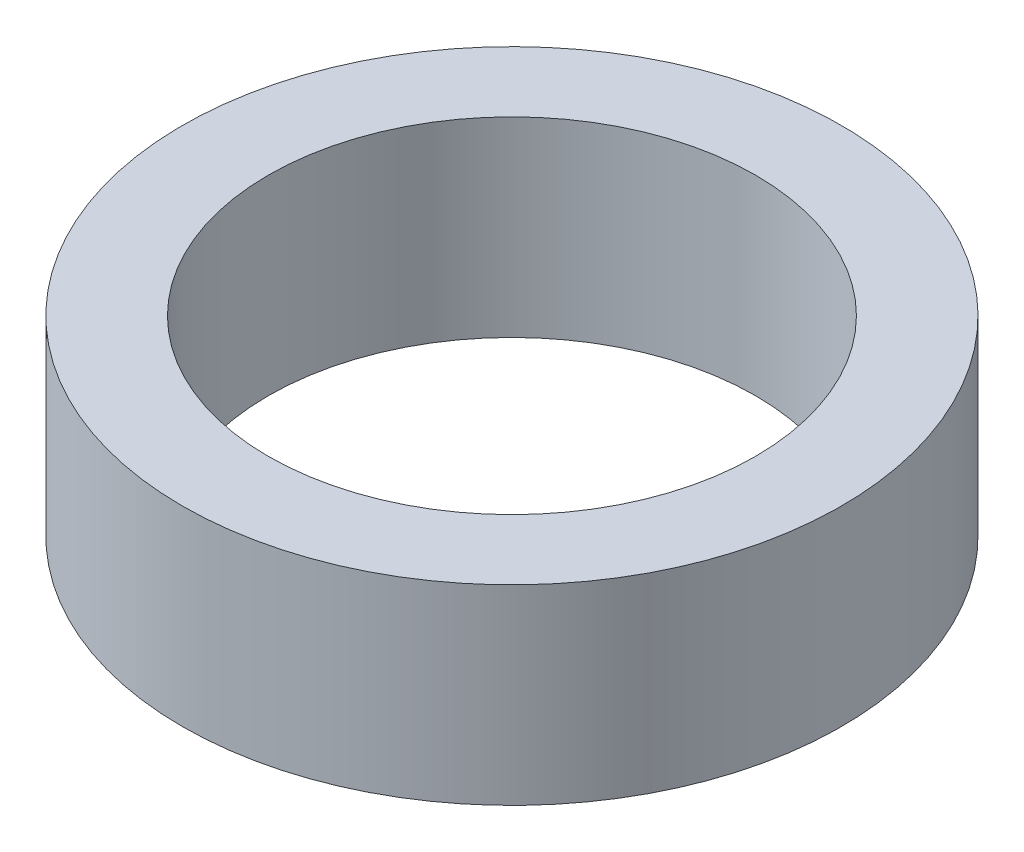
ISO-10303-21;
HEADER;
FILE_DESCRIPTION(('STEP AP214'),'2;1');
FILE_NAME('part.step','',(''),(''),'','','');
FILE_SCHEMA(('AUTOMOTIVE_DESIGN { 1 0 10303 214 1 1 1 1 }'));
ENDSEC;
DATA;
#1=APPLICATION_CONTEXT('core data for automotive mechanical design processes');
#2=APPLICATION_PROTOCOL_DEFINITION('international standard','automotive_design',2000,#1);
#3=PRODUCT_CONTEXT('',#1,'mechanical');
#4=PRODUCT('Part','Part','',(#3));
#5=PRODUCT_RELATED_PRODUCT_CATEGORY('part','',(#4));
#6=PRODUCT_DEFINITION_FORMATION('','',#4);
#7=PRODUCT_DEFINITION_CONTEXT('part definition',#1,'design');
#8=PRODUCT_DEFINITION('design','',#6,#7);
#9=PRODUCT_DEFINITION_SHAPE('','',#8);
#10=(LENGTH_UNIT() NAMED_UNIT(*) SI_UNIT(.MILLI.,.METRE.));
#11=(NAMED_UNIT(*) PLANE_ANGLE_UNIT() SI_UNIT($,.RADIAN.));
#12=(NAMED_UNIT(*) SI_UNIT($,.STERADIAN.) SOLID_ANGLE_UNIT());
#13=UNCERTAINTY_MEASURE_WITH_UNIT(LENGTH_MEASURE(1.E-05),#10,'distance_accuracy_value','');
#14=(GEOMETRIC_REPRESENTATION_CONTEXT(3) GLOBAL_UNCERTAINTY_ASSIGNED_CONTEXT((#13)) GLOBAL_UNIT_ASSIGNED_CONTEXT((#10,
#11,#12)) REPRESENTATION_CONTEXT('',''));
#15=CARTESIAN_POINT('',(0.,0.,0.));
#16=DIRECTION('',(0.,0.,1.));
#17=DIRECTION('',(1.,0.,0.));
#18=AXIS2_PLACEMENT_3D('',#15,#16,#17);
#19=CARTESIAN_POINT('',(0.,2.,0.));
#20=DIRECTION('',(0.,-1.,0.));
#21=DIRECTION('',(0.,0.,-1.));
#22=AXIS2_PLACEMENT_3D('',#19,#20,#21);
#23=CYLINDRICAL_SURFACE('',#22,2.55);
#24=CARTESIAN_POINT('',(0.,2.,0.));
#25=DIRECTION('',(0.,1.,0.));
#26=DIRECTION('',(0.,0.,1.));
#27=AXIS2_PLACEMENT_3D('',#24,#25,#26);
#28=CIRCLE('',#27,2.55);
#29=CARTESIAN_POINT('',(0.,2.,2.55));
#30=VERTEX_POINT('',#29);
#31=EDGE_CURVE('E57',#30,#30,#28,.T.);
#32=ORIENTED_EDGE('',*,*,#31,.T.);
#33=EDGE_LOOP('',(#32));
#34=FACE_BOUND('',#33,.T.);
#35=CARTESIAN_POINT('',(0.,0.,0.));
#36=DIRECTION('',(0.,1.,0.));
#37=DIRECTION('',(0.,0.,1.));
#38=AXIS2_PLACEMENT_3D('',#35,#36,#37);
#39=CIRCLE('',#38,2.55);
#40=CARTESIAN_POINT('',(0.,0.,2.55));
#41=VERTEX_POINT('',#40);
#42=EDGE_CURVE('E11',#41,#41,#39,.T.);
#43=ORIENTED_EDGE('',*,*,#42,.F.);
#44=EDGE_LOOP('',(#43));
#45=FACE_BOUND('',#44,.T.);
#46=ADVANCED_FACE('F17',(#34,#45),#23,.F.);
#47=CARTESIAN_POINT('',(0.,2.,0.));
#48=DIRECTION('',(0.,-1.,0.));
#49=DIRECTION('',(0.,0.,-1.));
#50=AXIS2_PLACEMENT_3D('',#47,#48,#49);
#51=CYLINDRICAL_SURFACE('',#50,3.45);
#52=CARTESIAN_POINT('',(0.,2.,0.));
#53=DIRECTION('',(0.,1.,0.));
#54=DIRECTION('',(0.,0.,1.));
#55=AXIS2_PLACEMENT_3D('',#52,#53,#54);
#56=CIRCLE('',#55,3.45);
#57=CARTESIAN_POINT('',(0.,2.,3.45));
#58=VERTEX_POINT('',#57);
#59=EDGE_CURVE('E53',#58,#58,#56,.T.);
#60=ORIENTED_EDGE('',*,*,#59,.F.);
#61=EDGE_LOOP('',(#60));
#62=FACE_BOUND('',#61,.T.);
#63=CARTESIAN_POINT('',(0.,0.,0.));
#64=DIRECTION('',(0.,1.,0.));
#65=DIRECTION('',(0.,0.,1.));
#66=AXIS2_PLACEMENT_3D('',#63,#64,#65);
#67=CIRCLE('',#66,3.45);
#68=CARTESIAN_POINT('',(0.,0.,3.45));
#69=VERTEX_POINT('',#68);
#70=EDGE_CURVE('E25',#69,#69,#67,.T.);
#71=ORIENTED_EDGE('',*,*,#70,.T.);
#72=EDGE_LOOP('',(#71));
#73=FACE_BOUND('',#72,.T.);
#74=ADVANCED_FACE('F103',(#62,#73),#51,.T.);
#75=CARTESIAN_POINT('',(0.,0.,0.));
#76=DIRECTION('',(0.,1.,0.));
#77=DIRECTION('',(1.,0.,0.));
#78=AXIS2_PLACEMENT_3D('',#75,#76,#77);
#79=PLANE('',#78);
#80=ORIENTED_EDGE('',*,*,#42,.T.);
#81=EDGE_LOOP('',(#80));
#82=FACE_BOUND('',#81,.T.);
#83=ORIENTED_EDGE('',*,*,#70,.F.);
#84=EDGE_LOOP('',(#83));
#85=FACE_BOUND('',#84,.T.);
#86=ADVANCED_FACE('F95',(#82,#85),#79,.F.);
#87=CARTESIAN_POINT('',(0.,2.,0.));
#88=DIRECTION('',(0.,1.,0.));
#89=DIRECTION('',(1.,0.,0.));
#90=AXIS2_PLACEMENT_3D('',#87,#88,#89);
#91=PLANE('',#90);
#92=ORIENTED_EDGE('',*,*,#31,.F.);
#93=EDGE_LOOP('',(#92));
#94=FACE_BOUND('',#93,.T.);
#95=ORIENTED_EDGE('',*,*,#59,.T.);
#96=EDGE_LOOP('',(#95));
#97=FACE_BOUND('',#96,.T.);
#98=ADVANCED_FACE('F54',(#94,#97),#91,.T.);
#99=CLOSED_SHELL('',(#46,#74,#86,#98));
#100=MANIFOLD_SOLID_BREP('B1',#99);
#101=ADVANCED_BREP_SHAPE_REPRESENTATION('',(#18,#100),#14);
#102=SHAPE_DEFINITION_REPRESENTATION(#9,#101);
ENDSEC;
END-ISO-10303-21;
